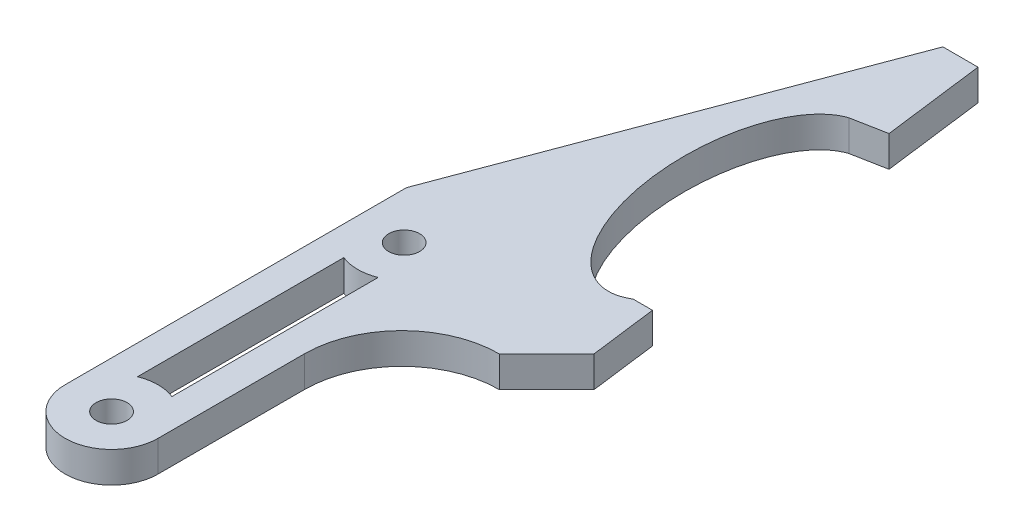
ISO-10303-21;
HEADER;
FILE_DESCRIPTION(('STEP AP214'),'2;1');
FILE_NAME('part.step','',(''),(''),'','','');
FILE_SCHEMA(('AUTOMOTIVE_DESIGN { 1 0 10303 214 1 1 1 1 }'));
ENDSEC;
DATA;
#1=APPLICATION_CONTEXT('core data for automotive mechanical design processes');
#2=APPLICATION_PROTOCOL_DEFINITION('international standard','automotive_design',2000,#1);
#3=PRODUCT_CONTEXT('',#1,'mechanical');
#4=PRODUCT('Part','Part','',(#3));
#5=PRODUCT_RELATED_PRODUCT_CATEGORY('part','',(#4));
#6=PRODUCT_DEFINITION_FORMATION('','',#4);
#7=PRODUCT_DEFINITION_CONTEXT('part definition',#1,'design');
#8=PRODUCT_DEFINITION('design','',#6,#7);
#9=PRODUCT_DEFINITION_SHAPE('','',#8);
#10=(LENGTH_UNIT() NAMED_UNIT(*) SI_UNIT(.MILLI.,.METRE.));
#11=(NAMED_UNIT(*) PLANE_ANGLE_UNIT() SI_UNIT($,.RADIAN.));
#12=(NAMED_UNIT(*) SI_UNIT($,.STERADIAN.) SOLID_ANGLE_UNIT());
#13=UNCERTAINTY_MEASURE_WITH_UNIT(LENGTH_MEASURE(1.E-05),#10,'distance_accuracy_value','');
#14=(GEOMETRIC_REPRESENTATION_CONTEXT(3) GLOBAL_UNCERTAINTY_ASSIGNED_CONTEXT((#13)) GLOBAL_UNIT_ASSIGNED_CONTEXT((#10,
#11,#12)) REPRESENTATION_CONTEXT('',''));
#15=CARTESIAN_POINT('',(0.,0.,0.));
#16=DIRECTION('',(0.,0.,1.));
#17=DIRECTION('',(1.,0.,0.));
#18=AXIS2_PLACEMENT_3D('',#15,#16,#17);
#19=CARTESIAN_POINT('',(12.5,0.,10.));
#20=DIRECTION('',(-0.991907308323476,0.,0.126964135465405));
#21=DIRECTION('',(0.126964135465405,0.,0.991907308323476));
#22=AXIS2_PLACEMENT_3D('',#19,#20,#21);
#23=PLANE('',#22);
#24=DIRECTION('',(0.126964135465405,0.,0.991907308323476));
#25=VECTOR('',#24,1.);
#26=CARTESIAN_POINT('',(12.5,0.,10.));
#27=LINE('',#26,#25);
#28=CARTESIAN_POINT('',(10.9994402919683,0.,-1.72312271899777));
#29=VERTEX_POINT('',#28);
#30=CARTESIAN_POINT('',(11.8787234042553,0.,5.14627659574474));
#31=VERTEX_POINT('',#30);
#32=EDGE_CURVE('E212',#29,#31,#27,.T.);
#33=ORIENTED_EDGE('',*,*,#32,.F.);
#34=DIRECTION('',(0.,1.,0.));
#35=VECTOR('',#34,1.);
#36=CARTESIAN_POINT('',(10.9994402919683,0.,-1.72312271899777));
#37=LINE('',#36,#35);
#38=CARTESIAN_POINT('',(10.9994402919683,3.175,-1.72312271899777));
#39=VERTEX_POINT('',#38);
#40=EDGE_CURVE('E171',#29,#39,#37,.T.);
#41=ORIENTED_EDGE('',*,*,#40,.T.);
#42=DIRECTION('',(0.126964135465405,0.,0.991907308323476));
#43=VECTOR('',#42,1.);
#44=CARTESIAN_POINT('',(12.5,3.175,10.));
#45=LINE('',#44,#43);
#46=CARTESIAN_POINT('',(11.8787234042553,3.175,5.14627659574474));
#47=VERTEX_POINT('',#46);
#48=EDGE_CURVE('E163',#39,#47,#45,.T.);
#49=ORIENTED_EDGE('',*,*,#48,.T.);
#50=DIRECTION('',(0.,1.,0.));
#51=VECTOR('',#50,1.);
#52=CARTESIAN_POINT('',(11.8787234042553,-6.825,5.14627659574474));
#53=LINE('',#52,#51);
#54=EDGE_CURVE('E169',#31,#47,#53,.T.);
#55=ORIENTED_EDGE('',*,*,#54,.F.);
#56=EDGE_LOOP('',(#33,#41,#49,#55));
#57=FACE_BOUND('',#56,.T.);
#58=ADVANCED_FACE('F35',(#57),#23,.F.);
#59=CARTESIAN_POINT('',(7.025,3.175,20.));
#60=DIRECTION('',(0.,-1.,0.));
#61=DIRECTION('',(0.,0.,-1.));
#62=AXIS2_PLACEMENT_3D('',#59,#60,#61);
#63=PLANE('',#62);
#64=CARTESIAN_POINT('',(-7.7375,3.175,35.));
#65=DIRECTION('',(0.,1.,0.));
#66=DIRECTION('',(0.,0.,1.));
#67=AXIS2_PLACEMENT_3D('',#64,#65,#66);
#68=CIRCLE('',#67,4.7625);
#69=CARTESIAN_POINT('',(-5.97499999999999,3.175,30.5756356388742));
#70=VERTEX_POINT('',#69);
#71=CARTESIAN_POINT('',(-9.5,3.175,30.5756356388742));
#72=VERTEX_POINT('',#71);
#73=EDGE_CURVE('E188',#70,#72,#68,.T.);
#74=ORIENTED_EDGE('',*,*,#73,.T.);
#75=DIRECTION('',(0.,0.,1.));
#76=VECTOR('',#75,1.);
#77=CARTESIAN_POINT('',(-9.5,3.175,0.));
#78=LINE('',#77,#76);
#79=CARTESIAN_POINT('',(-9.5,3.175,9.42705531363683));
#80=VERTEX_POINT('',#79);
#81=EDGE_CURVE('E197',#80,#72,#78,.T.);
#82=ORIENTED_EDGE('',*,*,#81,.F.);
#83=CARTESIAN_POINT('',(-7.7375,3.175,5.00000000000001));
#84=DIRECTION('',(0.,1.,0.));
#85=DIRECTION('',(0.,0.,1.));
#86=AXIS2_PLACEMENT_3D('',#83,#84,#85);
#87=CIRCLE('',#86,4.76499999999999);
#88=CARTESIAN_POINT('',(-5.97500000000001,3.175,9.42705531363683));
#89=VERTEX_POINT('',#88);
#90=EDGE_CURVE('E194',#80,#89,#87,.T.);
#91=ORIENTED_EDGE('',*,*,#90,.T.);
#92=DIRECTION('',(0.,0.,1.));
#93=VECTOR('',#92,1.);
#94=CARTESIAN_POINT('',(-5.975,3.175,0.));
#95=LINE('',#94,#93);
#96=EDGE_CURVE('E191',#89,#70,#95,.T.);
#97=ORIENTED_EDGE('',*,*,#96,.T.);
#98=EDGE_LOOP('',(#74,#82,#91,#97));
#99=FACE_BOUND('',#98,.T.);
#100=CARTESIAN_POINT('',(-7.7375,3.175,5.00000000000001));
#101=DIRECTION('',(0.,1.,0.));
#102=DIRECTION('',(0.,0.,1.));
#103=AXIS2_PLACEMENT_3D('',#100,#101,#102);
#104=CIRCLE('',#103,1.5875);
#105=CARTESIAN_POINT('',(-7.7375,3.175,6.58750000000001));
#106=VERTEX_POINT('',#105);
#107=EDGE_CURVE('E224',#106,#106,#104,.T.);
#108=ORIENTED_EDGE('',*,*,#107,.F.);
#109=EDGE_LOOP('',(#108));
#110=FACE_BOUND('',#109,.T.);
#111=CARTESIAN_POINT('',(-7.7375,3.175,35.));
#112=DIRECTION('',(0.,1.,0.));
#113=DIRECTION('',(0.,0.,1.));
#114=AXIS2_PLACEMENT_3D('',#111,#112,#113);
#115=CIRCLE('',#114,1.5875);
#116=CARTESIAN_POINT('',(-7.7375,3.175,36.5875));
#117=VERTEX_POINT('',#116);
#118=EDGE_CURVE('E218',#117,#117,#115,.T.);
#119=ORIENTED_EDGE('',*,*,#118,.F.);
#120=EDGE_LOOP('',(#119));
#121=FACE_BOUND('',#120,.T.);
#122=CARTESIAN_POINT('',(6.06176106,3.175,-15.09925225));
#123=DIRECTION('',(0.,-1.,0.));
#124=DIRECTION('',(-0.0948649227939681,0.,-0.995490153855524));
#125=AXIS2_PLACEMENT_3D('',#122,#123,#124);
#126=ELLIPSE('',#125,14.,7.03171193897706);
#127=CARTESIAN_POINT('',(9.02015466100621,3.175,-1.72312271899777));
#128=VERTEX_POINT('',#127);
#129=CARTESIAN_POINT('',(3.99376850116986,3.175,-28.8851984986171));
#130=VERTEX_POINT('',#129);
#131=EDGE_CURVE('E160',#128,#130,#126,.T.);
#132=ORIENTED_EDGE('',*,*,#131,.T.);
#133=DIRECTION('',(-0.982335785187948,0.,0.187126708780915));
#134=VECTOR('',#133,1.);
#135=CARTESIAN_POINT('',(7.43869715877435,3.175,-29.5414284470754));
#136=LINE('',#135,#134);
#137=CARTESIAN_POINT('',(7.43869715877435,3.175,-29.5414284470754));
#138=VERTEX_POINT('',#137);
#139=EDGE_CURVE('E11',#130,#138,#136,.F.);
#140=ORIENTED_EDGE('',*,*,#139,.T.);
#141=CARTESIAN_POINT('',(6.09999999999999,3.175,-40.));
#142=VERTEX_POINT('',#141);
#143=EDGE_CURVE('E213',#142,#138,#45,.T.);
#144=ORIENTED_EDGE('',*,*,#143,.F.);
#145=DIRECTION('',(-1.,0.,0.));
#146=VECTOR('',#145,1.);
#147=CARTESIAN_POINT('',(12.5,3.175,-40.));
#148=LINE('',#147,#146);
#149=CARTESIAN_POINT('',(2.49999999999999,3.175,-40.));
#150=VERTEX_POINT('',#149);
#151=EDGE_CURVE('E236',#142,#150,#148,.T.);
#152=ORIENTED_EDGE('',*,*,#151,.T.);
#153=DIRECTION('',(-0.351123441588392,0.,0.936329177569045));
#154=VECTOR('',#153,1.);
#155=CARTESIAN_POINT('',(2.49999999999999,3.175,-40.));
#156=LINE('',#155,#154);
#157=CARTESIAN_POINT('',(-12.5,3.175,0.));
#158=VERTEX_POINT('',#157);
#159=EDGE_CURVE('E238',#150,#158,#156,.T.);
#160=ORIENTED_EDGE('',*,*,#159,.T.);
#161=DIRECTION('',(0.,0.,1.));
#162=VECTOR('',#161,1.);
#163=CARTESIAN_POINT('',(-12.5,3.175,0.));
#164=LINE('',#163,#162);
#165=CARTESIAN_POINT('',(-12.5,3.175,35.));
#166=VERTEX_POINT('',#165);
#167=EDGE_CURVE('E240',#158,#166,#164,.T.);
#168=ORIENTED_EDGE('',*,*,#167,.T.);
#169=CARTESIAN_POINT('',(-7.7375,3.175,35.));
#170=DIRECTION('',(0.,1.,0.));
#171=DIRECTION('',(0.,0.,1.));
#172=AXIS2_PLACEMENT_3D('',#169,#170,#171);
#173=CIRCLE('',#172,4.76250000000001);
#174=CARTESIAN_POINT('',(-2.975,3.175,35.));
#175=VERTEX_POINT('',#174);
#176=EDGE_CURVE('E182',#166,#175,#173,.T.);
#177=ORIENTED_EDGE('',*,*,#176,.T.);
#178=DIRECTION('',(0.,0.,-1.));
#179=VECTOR('',#178,1.);
#180=CARTESIAN_POINT('',(-2.975,3.175,40.));
#181=LINE('',#180,#179);
#182=CARTESIAN_POINT('',(-2.975,3.175,20.));
#183=VERTEX_POINT('',#182);
#184=EDGE_CURVE('E230',#175,#183,#181,.T.);
#185=ORIENTED_EDGE('',*,*,#184,.T.);
#186=CARTESIAN_POINT('',(7.025,3.175,20.));
#187=DIRECTION('',(0.,-1.,0.));
#188=DIRECTION('',(0.,0.,-1.));
#189=AXIS2_PLACEMENT_3D('',#186,#187,#188);
#190=CIRCLE('',#189,10.);
#191=CARTESIAN_POINT('',(7.025,3.175,10.));
#192=VERTEX_POINT('',#191);
#193=EDGE_CURVE('E232',#183,#192,#190,.T.);
#194=ORIENTED_EDGE('',*,*,#193,.T.);
#195=DIRECTION('',(-0.707106781186551,0.,0.707106781186544));
#196=VECTOR('',#195,1.);
#197=CARTESIAN_POINT('',(7.025,3.175,10.));
#198=LINE('',#197,#196);
#199=EDGE_CURVE('E166',#47,#192,#198,.T.);
#200=ORIENTED_EDGE('',*,*,#199,.F.);
#201=ORIENTED_EDGE('',*,*,#48,.F.);
#202=DIRECTION('',(1.,0.,0.));
#203=VECTOR('',#202,1.);
#204=CARTESIAN_POINT('',(6.69802178908796,3.175,-1.72312271899777));
#205=LINE('',#204,#203);
#206=EDGE_CURVE('E150',#128,#39,#205,.T.);
#207=ORIENTED_EDGE('',*,*,#206,.F.);
#208=EDGE_LOOP('',(#132,#140,#144,#152,#160,#168,#177,#185,#194,#200,#201,#207));
#209=FACE_BOUND('',#208,.T.);
#210=ADVANCED_FACE('F159',(#99,#110,#121,#209),#63,.F.);
#211=CARTESIAN_POINT('',(7.025,0.,20.));
#212=DIRECTION('',(0.,-1.,0.));
#213=DIRECTION('',(0.,0.,-1.));
#214=AXIS2_PLACEMENT_3D('',#211,#212,#213);
#215=PLANE('',#214);
#216=CARTESIAN_POINT('',(6.09999999999999,0.,-40.));
#217=VERTEX_POINT('',#216);
#218=CARTESIAN_POINT('',(7.43869715877435,0.,-29.5414284470754));
#219=VERTEX_POINT('',#218);
#220=EDGE_CURVE('E209',#217,#219,#27,.T.);
#221=ORIENTED_EDGE('',*,*,#220,.T.);
#222=DIRECTION('',(0.982335785187948,0.,-0.187126708780915));
#223=VECTOR('',#222,1.);
#224=CARTESIAN_POINT('',(-2.06728173092096,0.,-27.7306193834219));
#225=LINE('',#224,#223);
#226=CARTESIAN_POINT('',(3.99376850116986,0.,-28.8851984986171));
#227=VERTEX_POINT('',#226);
#228=EDGE_CURVE('E57',#219,#227,#225,.F.);
#229=ORIENTED_EDGE('',*,*,#228,.T.);
#230=CARTESIAN_POINT('',(6.06176106,0.,-15.09925225));
#231=DIRECTION('',(0.,-1.,0.));
#232=DIRECTION('',(-0.0948649227939681,0.,-0.995490153855524));
#233=AXIS2_PLACEMENT_3D('',#230,#231,#232);
#234=ELLIPSE('',#233,14.,7.03171193897706);
#235=CARTESIAN_POINT('',(9.02015466100621,0.,-1.72312271899777));
#236=VERTEX_POINT('',#235);
#237=EDGE_CURVE('E167',#236,#227,#234,.T.);
#238=ORIENTED_EDGE('',*,*,#237,.F.);
#239=DIRECTION('',(1.,0.,0.));
#240=VECTOR('',#239,1.);
#241=CARTESIAN_POINT('',(6.69802178908796,0.,-1.72312271899777));
#242=LINE('',#241,#240);
#243=EDGE_CURVE('E153',#236,#29,#242,.T.);
#244=ORIENTED_EDGE('',*,*,#243,.T.);
#245=ORIENTED_EDGE('',*,*,#32,.T.);
#246=DIRECTION('',(0.707106781186551,0.,-0.707106781186544));
#247=VECTOR('',#246,1.);
#248=CARTESIAN_POINT('',(2.025,0.,15.));
#249=LINE('',#248,#247);
#250=CARTESIAN_POINT('',(7.025,0.,10.));
#251=VERTEX_POINT('',#250);
#252=EDGE_CURVE('E177',#251,#31,#249,.T.);
#253=ORIENTED_EDGE('',*,*,#252,.F.);
#254=CARTESIAN_POINT('',(7.025,0.,20.));
#255=DIRECTION('',(0.,-1.,0.));
#256=DIRECTION('',(0.,0.,-1.));
#257=AXIS2_PLACEMENT_3D('',#254,#255,#256);
#258=CIRCLE('',#257,10.);
#259=CARTESIAN_POINT('',(-2.975,0.,20.));
#260=VERTEX_POINT('',#259);
#261=EDGE_CURVE('E245',#260,#251,#258,.T.);
#262=ORIENTED_EDGE('',*,*,#261,.F.);
#263=DIRECTION('',(0.,0.,-1.));
#264=VECTOR('',#263,1.);
#265=CARTESIAN_POINT('',(-2.975,0.,40.));
#266=LINE('',#265,#264);
#267=CARTESIAN_POINT('',(-2.975,0.,35.));
#268=VERTEX_POINT('',#267);
#269=EDGE_CURVE('E227',#268,#260,#266,.T.);
#270=ORIENTED_EDGE('',*,*,#269,.F.);
#271=CARTESIAN_POINT('',(-7.7375,0.,35.));
#272=DIRECTION('',(0.,-1.,0.));
#273=DIRECTION('',(0.,0.,-1.));
#274=AXIS2_PLACEMENT_3D('',#271,#272,#273);
#275=CIRCLE('',#274,4.76250000000001);
#276=CARTESIAN_POINT('',(-12.5,0.,35.));
#277=VERTEX_POINT('',#276);
#278=EDGE_CURVE('E185',#268,#277,#275,.T.);
#279=ORIENTED_EDGE('',*,*,#278,.T.);
#280=DIRECTION('',(0.,0.,1.));
#281=VECTOR('',#280,1.);
#282=CARTESIAN_POINT('',(-12.5,0.,0.));
#283=LINE('',#282,#281);
#284=CARTESIAN_POINT('',(-12.5,0.,0.));
#285=VERTEX_POINT('',#284);
#286=EDGE_CURVE('E233',#285,#277,#283,.T.);
#287=ORIENTED_EDGE('',*,*,#286,.F.);
#288=DIRECTION('',(-0.351123441588392,0.,0.936329177569045));
#289=VECTOR('',#288,1.);
#290=CARTESIAN_POINT('',(2.49999999999999,0.,-40.));
#291=LINE('',#290,#289);
#292=CARTESIAN_POINT('',(2.49999999999999,0.,-40.));
#293=VERTEX_POINT('',#292);
#294=EDGE_CURVE('E250',#293,#285,#291,.T.);
#295=ORIENTED_EDGE('',*,*,#294,.F.);
#296=DIRECTION('',(-1.,0.,0.));
#297=VECTOR('',#296,1.);
#298=CARTESIAN_POINT('',(12.5,0.,-40.));
#299=LINE('',#298,#297);
#300=EDGE_CURVE('E248',#217,#293,#299,.T.);
#301=ORIENTED_EDGE('',*,*,#300,.F.);
#302=EDGE_LOOP('',(#221,#229,#238,#244,#245,#253,#262,#270,#279,#287,#295,#301));
#303=FACE_BOUND('',#302,.T.);
#304=DIRECTION('',(0.,0.,-1.));
#305=VECTOR('',#304,1.);
#306=CARTESIAN_POINT('',(-9.5,0.,20.));
#307=LINE('',#306,#305);
#308=CARTESIAN_POINT('',(-9.5,0.,30.5756356388742));
#309=VERTEX_POINT('',#308);
#310=CARTESIAN_POINT('',(-9.5,0.,9.42705531363683));
#311=VERTEX_POINT('',#310);
#312=EDGE_CURVE('E270',#309,#311,#307,.T.);
#313=ORIENTED_EDGE('',*,*,#312,.F.);
#314=CARTESIAN_POINT('',(-7.7375,0.,35.));
#315=DIRECTION('',(0.,-1.,0.));
#316=DIRECTION('',(0.,0.,-1.));
#317=AXIS2_PLACEMENT_3D('',#314,#315,#316);
#318=CIRCLE('',#317,4.7625);
#319=CARTESIAN_POINT('',(-5.97499999999999,0.,30.5756356388742));
#320=VERTEX_POINT('',#319);
#321=EDGE_CURVE('E272',#309,#320,#318,.T.);
#322=ORIENTED_EDGE('',*,*,#321,.T.);
#323=DIRECTION('',(0.,0.,-1.));
#324=VECTOR('',#323,1.);
#325=CARTESIAN_POINT('',(-5.97499999999999,0.,20.));
#326=LINE('',#325,#324);
#327=CARTESIAN_POINT('',(-5.975,0.,9.42705531363683));
#328=VERTEX_POINT('',#327);
#329=EDGE_CURVE('E264',#320,#328,#326,.T.);
#330=ORIENTED_EDGE('',*,*,#329,.T.);
#331=CARTESIAN_POINT('',(-7.7375,0.,5.00000000000001));
#332=DIRECTION('',(0.,-1.,0.));
#333=DIRECTION('',(0.,0.,-1.));
#334=AXIS2_PLACEMENT_3D('',#331,#332,#333);
#335=CIRCLE('',#334,4.76499999999999);
#336=EDGE_CURVE('E267',#328,#311,#335,.T.);
#337=ORIENTED_EDGE('',*,*,#336,.T.);
#338=EDGE_LOOP('',(#313,#322,#330,#337));
#339=FACE_BOUND('',#338,.T.);
#340=CARTESIAN_POINT('',(-7.7375,0.,5.00000000000001));
#341=DIRECTION('',(0.,1.,0.));
#342=DIRECTION('',(0.,0.,1.));
#343=AXIS2_PLACEMENT_3D('',#340,#341,#342);
#344=CIRCLE('',#343,1.5875);
#345=CARTESIAN_POINT('',(-7.7375,0.,6.58750000000001));
#346=VERTEX_POINT('',#345);
#347=EDGE_CURVE('E221',#346,#346,#344,.T.);
#348=ORIENTED_EDGE('',*,*,#347,.T.);
#349=EDGE_LOOP('',(#348));
#350=FACE_BOUND('',#349,.T.);
#351=CARTESIAN_POINT('',(-7.7375,0.,35.));
#352=DIRECTION('',(0.,1.,0.));
#353=DIRECTION('',(0.,0.,1.));
#354=AXIS2_PLACEMENT_3D('',#351,#352,#353);
#355=CIRCLE('',#354,1.5875);
#356=CARTESIAN_POINT('',(-7.7375,0.,36.5875));
#357=VERTEX_POINT('',#356);
#358=EDGE_CURVE('E217',#357,#357,#355,.T.);
#359=ORIENTED_EDGE('',*,*,#358,.T.);
#360=EDGE_LOOP('',(#359));
#361=FACE_BOUND('',#360,.T.);
#362=ADVANCED_FACE('F286',(#303,#339,#350,#361),#215,.T.);
#363=CARTESIAN_POINT('',(-2.975,3.175,40.));
#364=DIRECTION('',(-1.,0.,0.));
#365=DIRECTION('',(0.,0.,1.));
#366=AXIS2_PLACEMENT_3D('',#363,#364,#365);
#367=PLANE('',#366);
#368=DIRECTION('',(0.,1.,0.));
#369=VECTOR('',#368,1.);
#370=CARTESIAN_POINT('',(-2.975,-6.825,35.));
#371=LINE('',#370,#369);
#372=EDGE_CURVE('E180',#268,#175,#371,.T.);
#373=ORIENTED_EDGE('',*,*,#372,.F.);
#374=ORIENTED_EDGE('',*,*,#269,.T.);
#375=DIRECTION('',(0.,-1.,0.));
#376=VECTOR('',#375,1.);
#377=CARTESIAN_POINT('',(-2.975,3.175,20.));
#378=LINE('',#377,#376);
#379=EDGE_CURVE('E261',#183,#260,#378,.T.);
#380=ORIENTED_EDGE('',*,*,#379,.F.);
#381=ORIENTED_EDGE('',*,*,#184,.F.);
#382=EDGE_LOOP('',(#373,#374,#380,#381));
#383=FACE_BOUND('',#382,.T.);
#384=ADVANCED_FACE('F339',(#383),#367,.F.);
#385=CARTESIAN_POINT('',(7.025,3.175,20.));
#386=DIRECTION('',(0.,-1.,0.));
#387=DIRECTION('',(0.,0.,-1.));
#388=AXIS2_PLACEMENT_3D('',#385,#386,#387);
#389=CYLINDRICAL_SURFACE('',#388,10.);
#390=ORIENTED_EDGE('',*,*,#261,.T.);
#391=DIRECTION('',(0.,-1.,0.));
#392=VECTOR('',#391,1.);
#393=CARTESIAN_POINT('',(7.025,3.175,10.));
#394=LINE('',#393,#392);
#395=EDGE_CURVE('E259',#192,#251,#394,.T.);
#396=ORIENTED_EDGE('',*,*,#395,.F.);
#397=ORIENTED_EDGE('',*,*,#193,.F.);
#398=ORIENTED_EDGE('',*,*,#379,.T.);
#399=EDGE_LOOP('',(#390,#396,#397,#398));
#400=FACE_BOUND('',#399,.T.);
#401=ADVANCED_FACE('F347',(#400),#389,.F.);
#402=CARTESIAN_POINT('',(12.5,3.175,-40.));
#403=DIRECTION('',(0.,0.,1.));
#404=DIRECTION('',(1.,0.,0.));
#405=AXIS2_PLACEMENT_3D('',#402,#403,#404);
#406=PLANE('',#405);
#407=ORIENTED_EDGE('',*,*,#151,.F.);
#408=DIRECTION('',(0.,1.,0.));
#409=VECTOR('',#408,1.);
#410=CARTESIAN_POINT('',(6.09999999999999,0.,-40.));
#411=LINE('',#410,#409);
#412=EDGE_CURVE('E211',#217,#142,#411,.T.);
#413=ORIENTED_EDGE('',*,*,#412,.F.);
#414=ORIENTED_EDGE('',*,*,#300,.T.);
#415=DIRECTION('',(0.,-1.,0.));
#416=VECTOR('',#415,1.);
#417=CARTESIAN_POINT('',(2.49999999999999,3.175,-40.));
#418=LINE('',#417,#416);
#419=EDGE_CURVE('E256',#150,#293,#418,.T.);
#420=ORIENTED_EDGE('',*,*,#419,.F.);
#421=EDGE_LOOP('',(#407,#413,#414,#420));
#422=FACE_BOUND('',#421,.T.);
#423=ADVANCED_FACE('F293',(#422),#406,.F.);
#424=CARTESIAN_POINT('',(2.49999999999999,3.175,-40.));
#425=DIRECTION('',(0.936329177569044,0.,0.351123441588392));
#426=DIRECTION('',(0.351123441588392,0.,-0.936329177569045));
#427=AXIS2_PLACEMENT_3D('',#424,#425,#426);
#428=PLANE('',#427);
#429=ORIENTED_EDGE('',*,*,#294,.T.);
#430=DIRECTION('',(0.,-1.,0.));
#431=VECTOR('',#430,1.);
#432=CARTESIAN_POINT('',(-12.5,3.175,0.));
#433=LINE('',#432,#431);
#434=EDGE_CURVE('E243',#158,#285,#433,.T.);
#435=ORIENTED_EDGE('',*,*,#434,.F.);
#436=ORIENTED_EDGE('',*,*,#159,.F.);
#437=ORIENTED_EDGE('',*,*,#419,.T.);
#438=EDGE_LOOP('',(#429,#435,#436,#437));
#439=FACE_BOUND('',#438,.T.);
#440=ADVANCED_FACE('F296',(#439),#428,.F.);
#441=CARTESIAN_POINT('',(-12.5,3.175,0.));
#442=DIRECTION('',(1.,0.,0.));
#443=DIRECTION('',(0.,0.,-1.));
#444=AXIS2_PLACEMENT_3D('',#441,#442,#443);
#445=PLANE('',#444);
#446=ORIENTED_EDGE('',*,*,#286,.T.);
#447=DIRECTION('',(0.,1.,0.));
#448=VECTOR('',#447,1.);
#449=CARTESIAN_POINT('',(-12.5,-6.825,35.));
#450=LINE('',#449,#448);
#451=EDGE_CURVE('E155',#277,#166,#450,.T.);
#452=ORIENTED_EDGE('',*,*,#451,.T.);
#453=ORIENTED_EDGE('',*,*,#167,.F.);
#454=ORIENTED_EDGE('',*,*,#434,.T.);
#455=EDGE_LOOP('',(#446,#452,#453,#454));
#456=FACE_BOUND('',#455,.T.);
#457=ADVANCED_FACE('F333',(#456),#445,.F.);
#458=CARTESIAN_POINT('',(-7.7375,3.175,5.00000000000001));
#459=DIRECTION('',(0.,-1.,0.));
#460=DIRECTION('',(0.,0.,-1.));
#461=AXIS2_PLACEMENT_3D('',#458,#459,#460);
#462=CYLINDRICAL_SURFACE('',#461,1.5875);
#463=ORIENTED_EDGE('',*,*,#107,.T.);
#464=EDGE_LOOP('',(#463));
#465=FACE_BOUND('',#464,.T.);
#466=ORIENTED_EDGE('',*,*,#347,.F.);
#467=EDGE_LOOP('',(#466));
#468=FACE_BOUND('',#467,.T.);
#469=ADVANCED_FACE('F328',(#465,#468),#462,.F.);
#470=CARTESIAN_POINT('',(-7.7375,3.175,35.));
#471=DIRECTION('',(0.,-1.,0.));
#472=DIRECTION('',(0.,0.,-1.));
#473=AXIS2_PLACEMENT_3D('',#470,#471,#472);
#474=CYLINDRICAL_SURFACE('',#473,1.5875);
#475=ORIENTED_EDGE('',*,*,#118,.T.);
#476=EDGE_LOOP('',(#475));
#477=FACE_BOUND('',#476,.T.);
#478=ORIENTED_EDGE('',*,*,#358,.F.);
#479=EDGE_LOOP('',(#478));
#480=FACE_BOUND('',#479,.T.);
#481=ADVANCED_FACE('F319',(#477,#480),#474,.F.);
#482=ORIENTED_EDGE('',*,*,#143,.T.);
#483=DIRECTION('',(0.,-1.,0.));
#484=VECTOR('',#483,1.);
#485=CARTESIAN_POINT('',(7.43869715877435,0.,-29.5414284470754));
#486=LINE('',#485,#484);
#487=EDGE_CURVE('E154',#138,#219,#486,.T.);
#488=ORIENTED_EDGE('',*,*,#487,.T.);
#489=ORIENTED_EDGE('',*,*,#220,.F.);
#490=ORIENTED_EDGE('',*,*,#412,.T.);
#491=EDGE_LOOP('',(#482,#488,#489,#490));
#492=FACE_BOUND('',#491,.T.);
#493=ADVANCED_FACE('F281',(#492),#23,.F.);
#494=CARTESIAN_POINT('',(-7.7375,-6.825,35.));
#495=DIRECTION('',(0.,1.,0.));
#496=DIRECTION('',(0.,0.,1.));
#497=AXIS2_PLACEMENT_3D('',#494,#495,#496);
#498=CYLINDRICAL_SURFACE('',#497,4.7625);
#499=DIRECTION('',(0.,1.,0.));
#500=VECTOR('',#499,1.);
#501=CARTESIAN_POINT('',(-9.5,-6.825,30.5756356388742));
#502=LINE('',#501,#500);
#503=EDGE_CURVE('E201',#309,#72,#502,.T.);
#504=ORIENTED_EDGE('',*,*,#503,.T.);
#505=ORIENTED_EDGE('',*,*,#73,.F.);
#506=DIRECTION('',(0.,1.,0.));
#507=VECTOR('',#506,1.);
#508=CARTESIAN_POINT('',(-5.97499999999999,-6.825,30.5756356388742));
#509=LINE('',#508,#507);
#510=EDGE_CURVE('E200',#320,#70,#509,.T.);
#511=ORIENTED_EDGE('',*,*,#510,.F.);
#512=ORIENTED_EDGE('',*,*,#321,.F.);
#513=EDGE_LOOP('',(#504,#505,#511,#512));
#514=FACE_BOUND('',#513,.T.);
#515=ADVANCED_FACE('F318',(#514),#498,.T.);
#516=CARTESIAN_POINT('',(-9.5,-6.825,0.));
#517=DIRECTION('',(-1.,0.,0.));
#518=DIRECTION('',(0.,0.,1.));
#519=AXIS2_PLACEMENT_3D('',#516,#517,#518);
#520=PLANE('',#519);
#521=ORIENTED_EDGE('',*,*,#312,.T.);
#522=DIRECTION('',(0.,1.,0.));
#523=VECTOR('',#522,1.);
#524=CARTESIAN_POINT('',(-9.5,-6.825,9.42705531363683));
#525=LINE('',#524,#523);
#526=EDGE_CURVE('E203',#311,#80,#525,.T.);
#527=ORIENTED_EDGE('',*,*,#526,.T.);
#528=ORIENTED_EDGE('',*,*,#81,.T.);
#529=ORIENTED_EDGE('',*,*,#503,.F.);
#530=EDGE_LOOP('',(#521,#527,#528,#529));
#531=FACE_BOUND('',#530,.T.);
#532=ADVANCED_FACE('F325',(#531),#520,.F.);
#533=CARTESIAN_POINT('',(-7.7375,-6.825,5.00000000000001));
#534=DIRECTION('',(0.,1.,0.));
#535=DIRECTION('',(0.,0.,1.));
#536=AXIS2_PLACEMENT_3D('',#533,#534,#535);
#537=CYLINDRICAL_SURFACE('',#536,4.76499999999999);
#538=DIRECTION('',(0.,1.,0.));
#539=VECTOR('',#538,1.);
#540=CARTESIAN_POINT('',(-5.97500000000001,-6.825,9.42705531363683));
#541=LINE('',#540,#539);
#542=EDGE_CURVE('E205',#328,#89,#541,.T.);
#543=ORIENTED_EDGE('',*,*,#542,.T.);
#544=ORIENTED_EDGE('',*,*,#90,.F.);
#545=ORIENTED_EDGE('',*,*,#526,.F.);
#546=ORIENTED_EDGE('',*,*,#336,.F.);
#547=EDGE_LOOP('',(#543,#544,#545,#546));
#548=FACE_BOUND('',#547,.T.);
#549=ADVANCED_FACE('F375',(#548),#537,.T.);
#550=CARTESIAN_POINT('',(-5.975,-6.825,0.));
#551=DIRECTION('',(-1.,0.,0.));
#552=DIRECTION('',(0.,0.,1.));
#553=AXIS2_PLACEMENT_3D('',#550,#551,#552);
#554=PLANE('',#553);
#555=ORIENTED_EDGE('',*,*,#510,.T.);
#556=ORIENTED_EDGE('',*,*,#96,.F.);
#557=ORIENTED_EDGE('',*,*,#542,.F.);
#558=ORIENTED_EDGE('',*,*,#329,.F.);
#559=EDGE_LOOP('',(#555,#556,#557,#558));
#560=FACE_BOUND('',#559,.T.);
#561=ADVANCED_FACE('F367',(#560),#554,.T.);
#562=CARTESIAN_POINT('',(-7.7375,-6.825,35.));
#563=DIRECTION('',(0.,1.,0.));
#564=DIRECTION('',(0.,0.,1.));
#565=AXIS2_PLACEMENT_3D('',#562,#563,#564);
#566=CYLINDRICAL_SURFACE('',#565,4.76250000000001);
#567=ORIENTED_EDGE('',*,*,#372,.T.);
#568=ORIENTED_EDGE('',*,*,#176,.F.);
#569=ORIENTED_EDGE('',*,*,#451,.F.);
#570=ORIENTED_EDGE('',*,*,#278,.F.);
#571=EDGE_LOOP('',(#567,#568,#569,#570));
#572=FACE_BOUND('',#571,.T.);
#573=ADVANCED_FACE('F364',(#572),#566,.T.);
#574=CARTESIAN_POINT('',(7.025,-6.825,10.));
#575=DIRECTION('',(-0.707106781186544,0.,-0.707106781186551));
#576=DIRECTION('',(-0.707106781186551,0.,0.707106781186544));
#577=AXIS2_PLACEMENT_3D('',#574,#575,#576);
#578=PLANE('',#577);
#579=ORIENTED_EDGE('',*,*,#252,.T.);
#580=ORIENTED_EDGE('',*,*,#54,.T.);
#581=ORIENTED_EDGE('',*,*,#199,.T.);
#582=ORIENTED_EDGE('',*,*,#395,.T.);
#583=EDGE_LOOP('',(#579,#580,#581,#582));
#584=FACE_BOUND('',#583,.T.);
#585=ADVANCED_FACE('F366',(#584),#578,.F.);
#586=CARTESIAN_POINT('',(6.06176106,4.,-15.09925225));
#587=DIRECTION('',(0.,-1.,0.));
#588=DIRECTION('',(-0.0948649227939681,0.,-0.995490153855524));
#589=AXIS2_PLACEMENT_3D('',#586,#587,#588);
#590=ELLIPSE('',#589,14.,7.03171193897706);
#591=DIRECTION('',(0.,-1.,0.));
#592=VECTOR('',#591,1.);
#593=SURFACE_OF_LINEAR_EXTRUSION('',#590,#592);
#594=ORIENTED_EDGE('',*,*,#237,.T.);
#595=DIRECTION('',(0.,-1.,0.));
#596=VECTOR('',#595,1.);
#597=CARTESIAN_POINT('',(3.99376850116986,0.,-28.8851984986171));
#598=LINE('',#597,#596);
#599=EDGE_CURVE('E43',#227,#130,#598,.F.);
#600=ORIENTED_EDGE('',*,*,#599,.T.);
#601=ORIENTED_EDGE('',*,*,#131,.F.);
#602=DIRECTION('',(0.,-1.,0.));
#603=VECTOR('',#602,1.);
#604=CARTESIAN_POINT('',(9.02015466100621,1.5875,-1.72312271899777));
#605=LINE('',#604,#603);
#606=EDGE_CURVE('E147',#128,#236,#605,.T.);
#607=ORIENTED_EDGE('',*,*,#606,.T.);
#608=EDGE_LOOP('',(#594,#600,#601,#607));
#609=FACE_BOUND('',#608,.T.);
#610=ADVANCED_FACE('F165',(#609),#593,.F.);
#611=CARTESIAN_POINT('',(6.69802178908796,0.,-1.72312271899777));
#612=DIRECTION('',(0.,0.,1.));
#613=DIRECTION('',(1.,0.,0.));
#614=AXIS2_PLACEMENT_3D('',#611,#612,#613);
#615=PLANE('',#614);
#616=ORIENTED_EDGE('',*,*,#243,.F.);
#617=ORIENTED_EDGE('',*,*,#606,.F.);
#618=ORIENTED_EDGE('',*,*,#206,.T.);
#619=ORIENTED_EDGE('',*,*,#40,.F.);
#620=EDGE_LOOP('',(#616,#617,#618,#619));
#621=FACE_BOUND('',#620,.T.);
#622=ADVANCED_FACE('F149',(#621),#615,.F.);
#623=CARTESIAN_POINT('',(7.43869715877435,1.5875,-29.5414284470754));
#624=DIRECTION('',(-0.187126708780915,0.,-0.982335785187948));
#625=DIRECTION('',(0.,-1.,0.));
#626=AXIS2_PLACEMENT_3D('',#623,#624,#625);
#627=PLANE('',#626);
#628=ORIENTED_EDGE('',*,*,#139,.F.);
#629=ORIENTED_EDGE('',*,*,#599,.F.);
#630=ORIENTED_EDGE('',*,*,#228,.F.);
#631=ORIENTED_EDGE('',*,*,#487,.F.);
#632=EDGE_LOOP('',(#628,#629,#630,#631));
#633=FACE_BOUND('',#632,.T.);
#634=ADVANCED_FACE('F37',(#633),#627,.F.);
#635=CLOSED_SHELL('',(#58,#210,#362,#384,#401,#423,#440,#457,#469,#481,#493,#515,#532,#549,#561,
#573,#585,#610,#622,#634));
#636=MANIFOLD_SOLID_BREP('B2',#635);
#637=ADVANCED_BREP_SHAPE_REPRESENTATION('',(#18,#636),#14);
#638=SHAPE_DEFINITION_REPRESENTATION(#9,#637);
ENDSEC;
END-ISO-10303-21;
